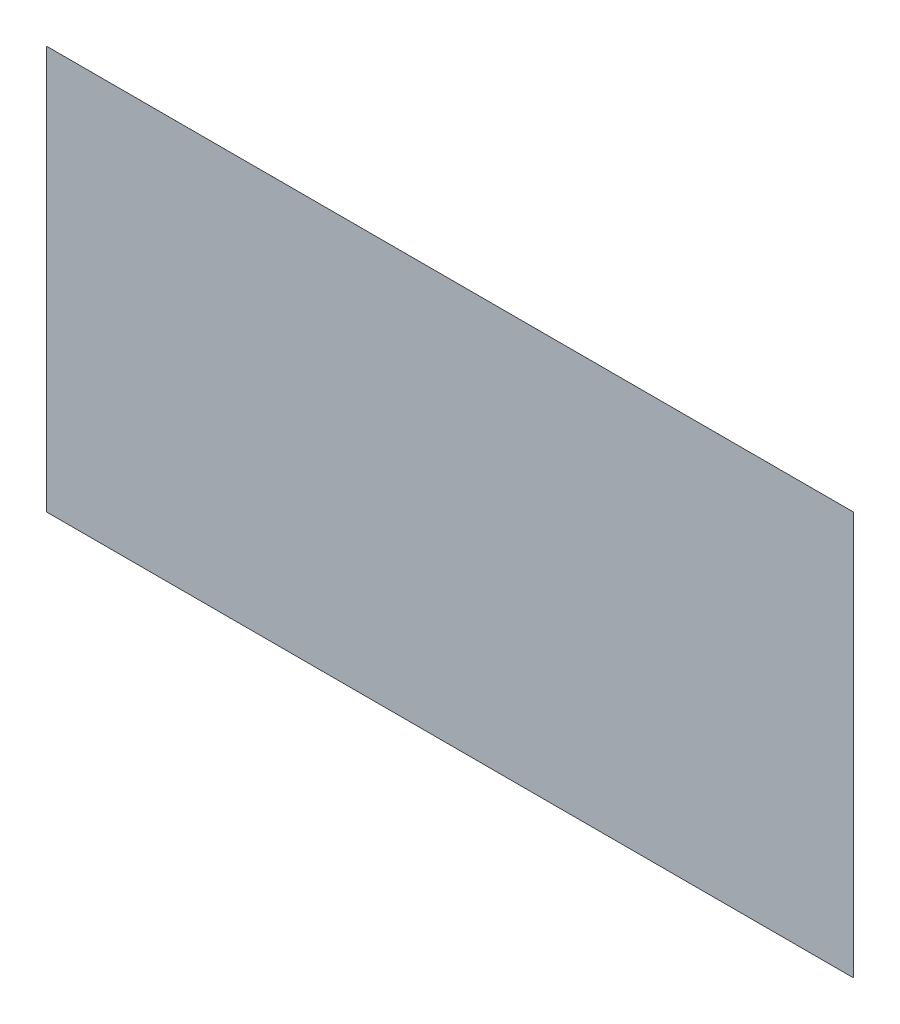
ISO-10303-21;
HEADER;
FILE_DESCRIPTION(('STEP AP214'),'2;1');
FILE_NAME('part.step','',(''),(''),'','','');
FILE_SCHEMA(('AUTOMOTIVE_DESIGN { 1 0 10303 214 1 1 1 1 }'));
ENDSEC;
DATA;
#1=APPLICATION_CONTEXT('core data for automotive mechanical design processes');
#2=APPLICATION_PROTOCOL_DEFINITION('international standard','automotive_design',2000,#1);
#3=PRODUCT_CONTEXT('',#1,'mechanical');
#4=PRODUCT('Part','Part','',(#3));
#5=PRODUCT_RELATED_PRODUCT_CATEGORY('part','',(#4));
#6=PRODUCT_DEFINITION_FORMATION('','',#4);
#7=PRODUCT_DEFINITION_CONTEXT('part definition',#1,'design');
#8=PRODUCT_DEFINITION('design','',#6,#7);
#9=PRODUCT_DEFINITION_SHAPE('','',#8);
#10=(LENGTH_UNIT() NAMED_UNIT(*) SI_UNIT(.MILLI.,.METRE.));
#11=(NAMED_UNIT(*) PLANE_ANGLE_UNIT() SI_UNIT($,.RADIAN.));
#12=(NAMED_UNIT(*) SI_UNIT($,.STERADIAN.) SOLID_ANGLE_UNIT());
#13=UNCERTAINTY_MEASURE_WITH_UNIT(LENGTH_MEASURE(1.E-05),#10,'distance_accuracy_value','');
#14=(GEOMETRIC_REPRESENTATION_CONTEXT(3) GLOBAL_UNCERTAINTY_ASSIGNED_CONTEXT((#13)) GLOBAL_UNIT_ASSIGNED_CONTEXT((#10,
#11,#12)) REPRESENTATION_CONTEXT('',''));
#15=CARTESIAN_POINT('',(0.,0.,0.));
#16=DIRECTION('',(0.,0.,1.));
#17=DIRECTION('',(1.,0.,0.));
#18=AXIS2_PLACEMENT_3D('',#15,#16,#17);
#19=CARTESIAN_POINT('',(10.872,5.432,0.0001));
#20=DIRECTION('',(-1.,0.,0.));
#21=DIRECTION('',(0.,-1.,0.));
#22=AXIS2_PLACEMENT_3D('',#19,#20,#21);
#23=PLANE('',#22);
#24=DIRECTION('',(0.,1.,0.));
#25=VECTOR('',#24,1.);
#26=CARTESIAN_POINT('',(10.872,5.432,0.));
#27=LINE('',#26,#25);
#28=CARTESIAN_POINT('',(10.872,-5.432,0.));
#29=VERTEX_POINT('',#28);
#30=CARTESIAN_POINT('',(10.872,5.432,0.));
#31=VERTEX_POINT('',#30);
#32=EDGE_CURVE('E96',#29,#31,#27,.T.);
#33=ORIENTED_EDGE('',*,*,#32,.T.);
#34=DIRECTION('',(0.,0.,-1.));
#35=VECTOR('',#34,1.);
#36=CARTESIAN_POINT('',(10.872,5.432,0.0001));
#37=LINE('',#36,#35);
#38=CARTESIAN_POINT('',(10.872,5.432,0.0001));
#39=VERTEX_POINT('',#38);
#40=EDGE_CURVE('E11',#39,#31,#37,.T.);
#41=ORIENTED_EDGE('',*,*,#40,.F.);
#42=DIRECTION('',(0.,1.,0.));
#43=VECTOR('',#42,1.);
#44=CARTESIAN_POINT('',(10.872,5.432,0.0001));
#45=LINE('',#44,#43);
#46=CARTESIAN_POINT('',(10.872,-5.432,0.0001));
#47=VERTEX_POINT('',#46);
#48=EDGE_CURVE('E84',#47,#39,#45,.T.);
#49=ORIENTED_EDGE('',*,*,#48,.F.);
#50=DIRECTION('',(0.,0.,-1.));
#51=VECTOR('',#50,1.);
#52=CARTESIAN_POINT('',(10.872,-5.432,0.0001));
#53=LINE('',#52,#51);
#54=EDGE_CURVE('E92',#47,#29,#53,.T.);
#55=ORIENTED_EDGE('',*,*,#54,.T.);
#56=EDGE_LOOP('',(#33,#41,#49,#55));
#57=FACE_BOUND('',#56,.T.);
#58=ADVANCED_FACE('F33',(#57),#23,.F.);
#59=CARTESIAN_POINT('',(-10.872,5.432,0.0001));
#60=DIRECTION('',(0.,-1.,0.));
#61=DIRECTION('',(0.,0.,-1.));
#62=AXIS2_PLACEMENT_3D('',#59,#60,#61);
#63=PLANE('',#62);
#64=DIRECTION('',(-1.,0.,0.));
#65=VECTOR('',#64,1.);
#66=CARTESIAN_POINT('',(-10.872,5.432,0.));
#67=LINE('',#66,#65);
#68=CARTESIAN_POINT('',(-10.872,5.432,0.));
#69=VERTEX_POINT('',#68);
#70=EDGE_CURVE('E88',#31,#69,#67,.T.);
#71=ORIENTED_EDGE('',*,*,#70,.T.);
#72=DIRECTION('',(0.,0.,-1.));
#73=VECTOR('',#72,1.);
#74=CARTESIAN_POINT('',(-10.872,5.432,0.0001));
#75=LINE('',#74,#73);
#76=CARTESIAN_POINT('',(-10.872,5.432,0.0001));
#77=VERTEX_POINT('',#76);
#78=EDGE_CURVE('E41',#77,#69,#75,.T.);
#79=ORIENTED_EDGE('',*,*,#78,.F.);
#80=DIRECTION('',(-1.,0.,0.));
#81=VECTOR('',#80,1.);
#82=CARTESIAN_POINT('',(-10.872,5.432,0.0001));
#83=LINE('',#82,#81);
#84=EDGE_CURVE('E79',#39,#77,#83,.T.);
#85=ORIENTED_EDGE('',*,*,#84,.F.);
#86=ORIENTED_EDGE('',*,*,#40,.T.);
#87=EDGE_LOOP('',(#71,#79,#85,#86));
#88=FACE_BOUND('',#87,.T.);
#89=ADVANCED_FACE('F87',(#88),#63,.F.);
#90=CARTESIAN_POINT('',(-10.872,5.432,0.0001));
#91=DIRECTION('',(1.,0.,0.));
#92=DIRECTION('',(0.,1.,0.));
#93=AXIS2_PLACEMENT_3D('',#90,#91,#92);
#94=PLANE('',#93);
#95=DIRECTION('',(0.,-1.,0.));
#96=VECTOR('',#95,1.);
#97=CARTESIAN_POINT('',(-10.872,5.432,0.));
#98=LINE('',#97,#96);
#99=CARTESIAN_POINT('',(-10.872,-5.432,0.));
#100=VERTEX_POINT('',#99);
#101=EDGE_CURVE('E66',#69,#100,#98,.T.);
#102=ORIENTED_EDGE('',*,*,#101,.T.);
#103=DIRECTION('',(0.,0.,-1.));
#104=VECTOR('',#103,1.);
#105=CARTESIAN_POINT('',(-10.872,-5.432,0.0001));
#106=LINE('',#105,#104);
#107=CARTESIAN_POINT('',(-10.872,-5.432,0.0001));
#108=VERTEX_POINT('',#107);
#109=EDGE_CURVE('E89',#108,#100,#106,.T.);
#110=ORIENTED_EDGE('',*,*,#109,.F.);
#111=DIRECTION('',(0.,-1.,0.));
#112=VECTOR('',#111,1.);
#113=CARTESIAN_POINT('',(-10.872,5.432,0.0001));
#114=LINE('',#113,#112);
#115=EDGE_CURVE('E82',#77,#108,#114,.T.);
#116=ORIENTED_EDGE('',*,*,#115,.F.);
#117=ORIENTED_EDGE('',*,*,#78,.T.);
#118=EDGE_LOOP('',(#102,#110,#116,#117));
#119=FACE_BOUND('',#118,.T.);
#120=ADVANCED_FACE('F90',(#119),#94,.F.);
#121=CARTESIAN_POINT('',(-10.872,-5.432,0.0001));
#122=DIRECTION('',(0.,1.,0.));
#123=DIRECTION('',(0.,0.,1.));
#124=AXIS2_PLACEMENT_3D('',#121,#122,#123);
#125=PLANE('',#124);
#126=DIRECTION('',(1.,0.,0.));
#127=VECTOR('',#126,1.);
#128=CARTESIAN_POINT('',(-10.872,-5.432,0.));
#129=LINE('',#128,#127);
#130=EDGE_CURVE('E72',#100,#29,#129,.T.);
#131=ORIENTED_EDGE('',*,*,#130,.T.);
#132=ORIENTED_EDGE('',*,*,#54,.F.);
#133=DIRECTION('',(1.,0.,0.));
#134=VECTOR('',#133,1.);
#135=CARTESIAN_POINT('',(-10.872,-5.432,0.0001));
#136=LINE('',#135,#134);
#137=EDGE_CURVE('E49',#108,#47,#136,.T.);
#138=ORIENTED_EDGE('',*,*,#137,.F.);
#139=ORIENTED_EDGE('',*,*,#109,.T.);
#140=EDGE_LOOP('',(#131,#132,#138,#139));
#141=FACE_BOUND('',#140,.T.);
#142=ADVANCED_FACE('F103',(#141),#125,.F.);
#143=CARTESIAN_POINT('',(0.,0.,0.0001));
#144=DIRECTION('',(0.,0.,1.));
#145=DIRECTION('',(1.,0.,0.));
#146=AXIS2_PLACEMENT_3D('',#143,#144,#145);
#147=PLANE('',#146);
#148=ORIENTED_EDGE('',*,*,#48,.T.);
#149=ORIENTED_EDGE('',*,*,#84,.T.);
#150=ORIENTED_EDGE('',*,*,#115,.T.);
#151=ORIENTED_EDGE('',*,*,#137,.T.);
#152=EDGE_LOOP('',(#148,#149,#150,#151));
#153=FACE_BOUND('',#152,.T.);
#154=ADVANCED_FACE('F80',(#153),#147,.T.);
#155=CARTESIAN_POINT('',(0.,0.,0.));
#156=DIRECTION('',(0.,0.,1.));
#157=DIRECTION('',(1.,0.,0.));
#158=AXIS2_PLACEMENT_3D('',#155,#156,#157);
#159=PLANE('',#158);
#160=ORIENTED_EDGE('',*,*,#32,.F.);
#161=ORIENTED_EDGE('',*,*,#130,.F.);
#162=ORIENTED_EDGE('',*,*,#101,.F.);
#163=ORIENTED_EDGE('',*,*,#70,.F.);
#164=EDGE_LOOP('',(#160,#161,#162,#163));
#165=FACE_BOUND('',#164,.T.);
#166=ADVANCED_FACE('F106',(#165),#159,.F.);
#167=CLOSED_SHELL('',(#58,#89,#120,#142,#154,#166));
#168=MANIFOLD_SOLID_BREP('B2',#167);
#169=ADVANCED_BREP_SHAPE_REPRESENTATION('',(#18,#168),#14);
#170=SHAPE_DEFINITION_REPRESENTATION(#9,#169);
ENDSEC;
END-ISO-10303-21;
